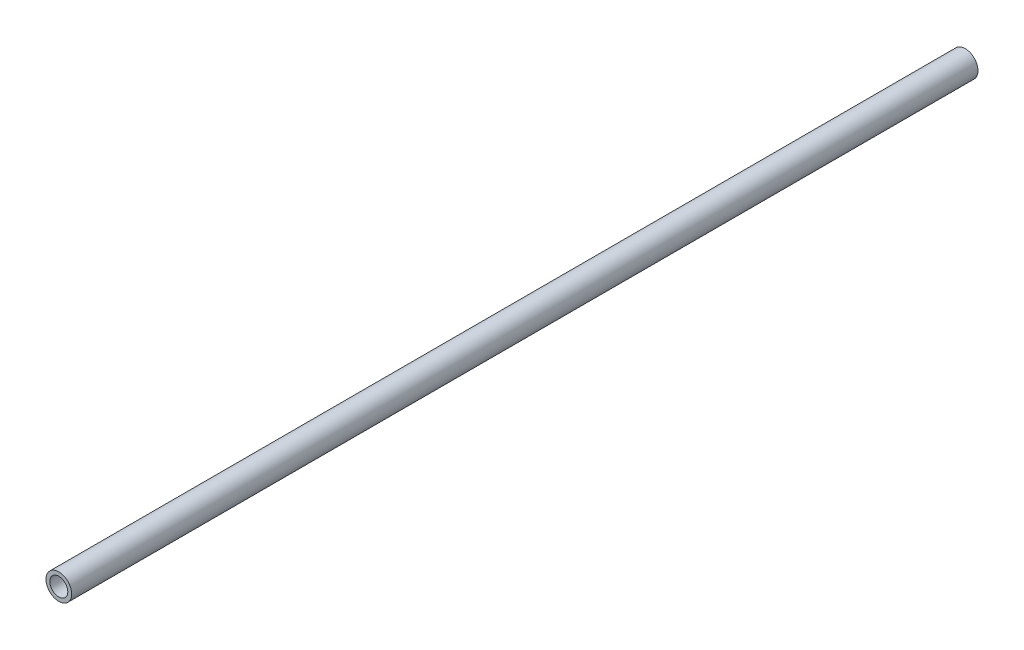
ISO-10303-21;
HEADER;
FILE_DESCRIPTION(('STEP AP214'),'2;1');
FILE_NAME('part.step','',(''),(''),'','','');
FILE_SCHEMA(('AUTOMOTIVE_DESIGN { 1 0 10303 214 1 1 1 1 }'));
ENDSEC;
DATA;
#1=APPLICATION_CONTEXT('core data for automotive mechanical design processes');
#2=APPLICATION_PROTOCOL_DEFINITION('international standard','automotive_design',2000,#1);
#3=PRODUCT_CONTEXT('',#1,'mechanical');
#4=PRODUCT('Part','Part','',(#3));
#5=PRODUCT_RELATED_PRODUCT_CATEGORY('part','',(#4));
#6=PRODUCT_DEFINITION_FORMATION('','',#4);
#7=PRODUCT_DEFINITION_CONTEXT('part definition',#1,'design');
#8=PRODUCT_DEFINITION('design','',#6,#7);
#9=PRODUCT_DEFINITION_SHAPE('','',#8);
#10=(LENGTH_UNIT() NAMED_UNIT(*) SI_UNIT(.MILLI.,.METRE.));
#11=(NAMED_UNIT(*) PLANE_ANGLE_UNIT() SI_UNIT($,.RADIAN.));
#12=(NAMED_UNIT(*) SI_UNIT($,.STERADIAN.) SOLID_ANGLE_UNIT());
#13=UNCERTAINTY_MEASURE_WITH_UNIT(LENGTH_MEASURE(1.E-05),#10,'distance_accuracy_value','');
#14=(GEOMETRIC_REPRESENTATION_CONTEXT(3) GLOBAL_UNCERTAINTY_ASSIGNED_CONTEXT((#13)) GLOBAL_UNIT_ASSIGNED_CONTEXT((#10,
#11,#12)) REPRESENTATION_CONTEXT('',''));
#15=CARTESIAN_POINT('',(0.,0.,0.));
#16=DIRECTION('',(0.,0.,1.));
#17=DIRECTION('',(1.,0.,0.));
#18=AXIS2_PLACEMENT_3D('',#15,#16,#17);
#19=CARTESIAN_POINT('',(0.,0.,106.));
#20=DIRECTION('',(0.,0.,1.));
#21=DIRECTION('',(1.,0.,0.));
#22=AXIS2_PLACEMENT_3D('',#19,#20,#21);
#23=PLANE('',#22);
#24=CARTESIAN_POINT('',(0.,0.,106.));
#25=DIRECTION('',(0.,0.,1.));
#26=DIRECTION('',(1.,0.,0.));
#27=AXIS2_PLACEMENT_3D('',#24,#25,#26);
#28=CIRCLE('',#27,1.5);
#29=CARTESIAN_POINT('',(1.5,0.,106.));
#30=VERTEX_POINT('',#29);
#31=EDGE_CURVE('E10',#30,#30,#28,.T.);
#32=ORIENTED_EDGE('',*,*,#31,.T.);
#33=EDGE_LOOP('',(#32));
#34=FACE_BOUND('',#33,.T.);
#35=CARTESIAN_POINT('',(0.,0.,106.));
#36=DIRECTION('',(0.,0.,1.));
#37=DIRECTION('',(1.,0.,0.));
#38=AXIS2_PLACEMENT_3D('',#35,#36,#37);
#39=CIRCLE('',#38,1.05);
#40=CARTESIAN_POINT('',(1.05,0.,106.));
#41=VERTEX_POINT('',#40);
#42=EDGE_CURVE('E25',#41,#41,#39,.T.);
#43=ORIENTED_EDGE('',*,*,#42,.F.);
#44=EDGE_LOOP('',(#43));
#45=FACE_BOUND('',#44,.T.);
#46=ADVANCED_FACE('F14',(#34,#45),#23,.T.);
#47=CARTESIAN_POINT('',(0.,0.,0.));
#48=DIRECTION('',(0.,0.,1.));
#49=DIRECTION('',(1.,0.,0.));
#50=AXIS2_PLACEMENT_3D('',#47,#48,#49);
#51=PLANE('',#50);
#52=CARTESIAN_POINT('',(0.,0.,0.));
#53=DIRECTION('',(0.,0.,1.));
#54=DIRECTION('',(1.,0.,0.));
#55=AXIS2_PLACEMENT_3D('',#52,#53,#54);
#56=CIRCLE('',#55,1.5);
#57=CARTESIAN_POINT('',(1.5,0.,0.));
#58=VERTEX_POINT('',#57);
#59=EDGE_CURVE('E18',#58,#58,#56,.T.);
#60=ORIENTED_EDGE('',*,*,#59,.F.);
#61=EDGE_LOOP('',(#60));
#62=FACE_BOUND('',#61,.T.);
#63=CARTESIAN_POINT('',(0.,0.,0.));
#64=DIRECTION('',(0.,0.,1.));
#65=DIRECTION('',(1.,0.,0.));
#66=AXIS2_PLACEMENT_3D('',#63,#64,#65);
#67=CIRCLE('',#66,1.05);
#68=CARTESIAN_POINT('',(1.05,0.,0.));
#69=VERTEX_POINT('',#68);
#70=EDGE_CURVE('E27',#69,#69,#67,.T.);
#71=ORIENTED_EDGE('',*,*,#70,.T.);
#72=EDGE_LOOP('',(#71));
#73=FACE_BOUND('',#72,.T.);
#74=ADVANCED_FACE('F37',(#62,#73),#51,.F.);
#75=CARTESIAN_POINT('',(0.,0.,106.));
#76=DIRECTION('',(0.,0.,-1.));
#77=DIRECTION('',(-1.,0.,0.));
#78=AXIS2_PLACEMENT_3D('',#75,#76,#77);
#79=CYLINDRICAL_SURFACE('',#78,1.5);
#80=ORIENTED_EDGE('',*,*,#31,.F.);
#81=EDGE_LOOP('',(#80));
#82=FACE_BOUND('',#81,.T.);
#83=ORIENTED_EDGE('',*,*,#59,.T.);
#84=EDGE_LOOP('',(#83));
#85=FACE_BOUND('',#84,.T.);
#86=ADVANCED_FACE('F16',(#82,#85),#79,.T.);
#87=CARTESIAN_POINT('',(0.,0.,106.));
#88=DIRECTION('',(0.,0.,-1.));
#89=DIRECTION('',(-1.,0.,0.));
#90=AXIS2_PLACEMENT_3D('',#87,#88,#89);
#91=CYLINDRICAL_SURFACE('',#90,1.05);
#92=ORIENTED_EDGE('',*,*,#42,.T.);
#93=EDGE_LOOP('',(#92));
#94=FACE_BOUND('',#93,.T.);
#95=ORIENTED_EDGE('',*,*,#70,.F.);
#96=EDGE_LOOP('',(#95));
#97=FACE_BOUND('',#96,.T.);
#98=ADVANCED_FACE('F33',(#94,#97),#91,.F.);
#99=CLOSED_SHELL('',(#46,#74,#86,#98));
#100=MANIFOLD_SOLID_BREP('B1',#99);
#101=ADVANCED_BREP_SHAPE_REPRESENTATION('',(#18,#100),#14);
#102=SHAPE_DEFINITION_REPRESENTATION(#9,#101);
ENDSEC;
END-ISO-10303-21;
